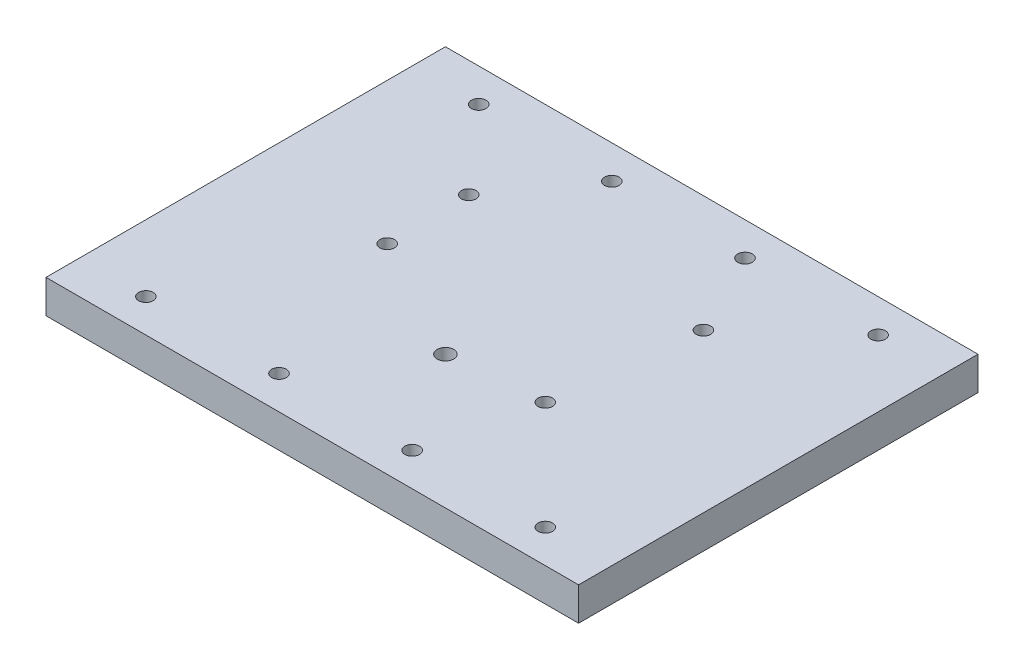
ISO-10303-21;
HEADER;
FILE_DESCRIPTION(('STEP AP214'),'2;1');
FILE_NAME('part.step','',(''),(''),'','','');
FILE_SCHEMA(('AUTOMOTIVE_DESIGN { 1 0 10303 214 1 1 1 1 }'));
ENDSEC;
DATA;
#1=APPLICATION_CONTEXT('core data for automotive mechanical design processes');
#2=APPLICATION_PROTOCOL_DEFINITION('international standard','automotive_design',2000,#1);
#3=PRODUCT_CONTEXT('',#1,'mechanical');
#4=PRODUCT('Part','Part','',(#3));
#5=PRODUCT_RELATED_PRODUCT_CATEGORY('part','',(#4));
#6=PRODUCT_DEFINITION_FORMATION('','',#4);
#7=PRODUCT_DEFINITION_CONTEXT('part definition',#1,'design');
#8=PRODUCT_DEFINITION('design','',#6,#7);
#9=PRODUCT_DEFINITION_SHAPE('','',#8);
#10=(LENGTH_UNIT() NAMED_UNIT(*) SI_UNIT(.MILLI.,.METRE.));
#11=(NAMED_UNIT(*) PLANE_ANGLE_UNIT() SI_UNIT($,.RADIAN.));
#12=(NAMED_UNIT(*) SI_UNIT($,.STERADIAN.) SOLID_ANGLE_UNIT());
#13=UNCERTAINTY_MEASURE_WITH_UNIT(LENGTH_MEASURE(1.E-05),#10,'distance_accuracy_value','');
#14=(GEOMETRIC_REPRESENTATION_CONTEXT(3) GLOBAL_UNCERTAINTY_ASSIGNED_CONTEXT((#13)) GLOBAL_UNIT_ASSIGNED_CONTEXT((#10,
#11,#12)) REPRESENTATION_CONTEXT('',''));
#15=CARTESIAN_POINT('',(0.,0.,0.));
#16=DIRECTION('',(0.,0.,1.));
#17=DIRECTION('',(1.,0.,0.));
#18=AXIS2_PLACEMENT_3D('',#15,#16,#17);
#19=CARTESIAN_POINT('',(177.8,0.,-139.7));
#20=DIRECTION('',(0.,1.,0.));
#21=DIRECTION('',(0.,0.,1.));
#22=AXIS2_PLACEMENT_3D('',#19,#20,#21);
#23=CYLINDRICAL_SURFACE('',#22,2.77812500000001);
#24=CARTESIAN_POINT('',(177.8,0.,-139.7));
#25=DIRECTION('',(0.,1.,0.));
#26=DIRECTION('',(0.,0.,1.));
#27=AXIS2_PLACEMENT_3D('',#24,#25,#26);
#28=CIRCLE('',#27,2.77812500000001);
#29=CARTESIAN_POINT('',(177.8,0.,-136.921875));
#30=VERTEX_POINT('',#29);
#31=EDGE_CURVE('E41',#30,#30,#28,.T.);
#32=ORIENTED_EDGE('',*,*,#31,.F.);
#33=EDGE_LOOP('',(#32));
#34=FACE_BOUND('',#33,.T.);
#35=CARTESIAN_POINT('',(177.8,12.7,-139.7));
#36=DIRECTION('',(0.,1.,0.));
#37=DIRECTION('',(0.,0.,1.));
#38=AXIS2_PLACEMENT_3D('',#35,#36,#37);
#39=CIRCLE('',#38,2.77812500000001);
#40=CARTESIAN_POINT('',(177.8,12.7,-136.921875));
#41=VERTEX_POINT('',#40);
#42=EDGE_CURVE('E11',#41,#41,#39,.T.);
#43=ORIENTED_EDGE('',*,*,#42,.T.);
#44=EDGE_LOOP('',(#43));
#45=FACE_BOUND('',#44,.T.);
#46=ADVANCED_FACE('F33',(#34,#45),#23,.F.);
#47=CARTESIAN_POINT('',(127.,0.,-139.7));
#48=DIRECTION('',(0.,1.,0.));
#49=DIRECTION('',(0.,0.,1.));
#50=AXIS2_PLACEMENT_3D('',#47,#48,#49);
#51=CYLINDRICAL_SURFACE('',#50,2.77812500000001);
#52=CARTESIAN_POINT('',(127.,0.,-139.7));
#53=DIRECTION('',(0.,1.,0.));
#54=DIRECTION('',(0.,0.,1.));
#55=AXIS2_PLACEMENT_3D('',#52,#53,#54);
#56=CIRCLE('',#55,2.77812500000001);
#57=CARTESIAN_POINT('',(127.,0.,-136.921875));
#58=VERTEX_POINT('',#57);
#59=EDGE_CURVE('E123',#58,#58,#56,.T.);
#60=ORIENTED_EDGE('',*,*,#59,.F.);
#61=EDGE_LOOP('',(#60));
#62=FACE_BOUND('',#61,.T.);
#63=CARTESIAN_POINT('',(127.,12.7,-139.7));
#64=DIRECTION('',(0.,1.,0.));
#65=DIRECTION('',(0.,0.,1.));
#66=AXIS2_PLACEMENT_3D('',#63,#64,#65);
#67=CIRCLE('',#66,2.77812500000001);
#68=CARTESIAN_POINT('',(127.,12.7,-136.921875));
#69=VERTEX_POINT('',#68);
#70=EDGE_CURVE('E126',#69,#69,#67,.T.);
#71=ORIENTED_EDGE('',*,*,#70,.T.);
#72=EDGE_LOOP('',(#71));
#73=FACE_BOUND('',#72,.T.);
#74=ADVANCED_FACE('F135',(#62,#73),#51,.F.);
#75=CARTESIAN_POINT('',(177.8,0.,-12.7));
#76=DIRECTION('',(0.,1.,0.));
#77=DIRECTION('',(0.,0.,1.));
#78=AXIS2_PLACEMENT_3D('',#75,#76,#77);
#79=CYLINDRICAL_SURFACE('',#78,2.778125);
#80=CARTESIAN_POINT('',(177.8,0.,-12.7));
#81=DIRECTION('',(0.,1.,0.));
#82=DIRECTION('',(0.,0.,1.));
#83=AXIS2_PLACEMENT_3D('',#80,#81,#82);
#84=CIRCLE('',#83,2.778125);
#85=CARTESIAN_POINT('',(177.8,0.,-9.921875));
#86=VERTEX_POINT('',#85);
#87=EDGE_CURVE('E117',#86,#86,#84,.T.);
#88=ORIENTED_EDGE('',*,*,#87,.F.);
#89=EDGE_LOOP('',(#88));
#90=FACE_BOUND('',#89,.T.);
#91=CARTESIAN_POINT('',(177.8,12.7,-12.7));
#92=DIRECTION('',(0.,1.,0.));
#93=DIRECTION('',(0.,0.,1.));
#94=AXIS2_PLACEMENT_3D('',#91,#92,#93);
#95=CIRCLE('',#94,2.778125);
#96=CARTESIAN_POINT('',(177.8,12.7,-9.921875));
#97=VERTEX_POINT('',#96);
#98=EDGE_CURVE('E120',#97,#97,#95,.T.);
#99=ORIENTED_EDGE('',*,*,#98,.T.);
#100=EDGE_LOOP('',(#99));
#101=FACE_BOUND('',#100,.T.);
#102=ADVANCED_FACE('F167',(#90,#101),#79,.F.);
#103=CARTESIAN_POINT('',(127.,0.,-12.7));
#104=DIRECTION('',(0.,1.,0.));
#105=DIRECTION('',(0.,0.,1.));
#106=AXIS2_PLACEMENT_3D('',#103,#104,#105);
#107=CYLINDRICAL_SURFACE('',#106,2.778125);
#108=CARTESIAN_POINT('',(127.,0.,-12.7));
#109=DIRECTION('',(0.,1.,0.));
#110=DIRECTION('',(0.,0.,1.));
#111=AXIS2_PLACEMENT_3D('',#108,#109,#110);
#112=CIRCLE('',#111,2.778125);
#113=CARTESIAN_POINT('',(127.,0.,-9.921875));
#114=VERTEX_POINT('',#113);
#115=EDGE_CURVE('E111',#114,#114,#112,.T.);
#116=ORIENTED_EDGE('',*,*,#115,.F.);
#117=EDGE_LOOP('',(#116));
#118=FACE_BOUND('',#117,.T.);
#119=CARTESIAN_POINT('',(127.,12.7,-12.7));
#120=DIRECTION('',(0.,1.,0.));
#121=DIRECTION('',(0.,0.,1.));
#122=AXIS2_PLACEMENT_3D('',#119,#120,#121);
#123=CIRCLE('',#122,2.778125);
#124=CARTESIAN_POINT('',(127.,12.7,-9.921875));
#125=VERTEX_POINT('',#124);
#126=EDGE_CURVE('E114',#125,#125,#123,.T.);
#127=ORIENTED_EDGE('',*,*,#126,.T.);
#128=EDGE_LOOP('',(#127));
#129=FACE_BOUND('',#128,.T.);
#130=ADVANCED_FACE('F163',(#118,#129),#107,.F.);
#131=CARTESIAN_POINT('',(0.,12.7,0.));
#132=DIRECTION('',(1.,0.,0.));
#133=DIRECTION('',(0.,0.,-1.));
#134=AXIS2_PLACEMENT_3D('',#131,#132,#133);
#135=PLANE('',#134);
#136=DIRECTION('',(0.,0.,1.));
#137=VECTOR('',#136,1.);
#138=CARTESIAN_POINT('',(0.,0.,0.));
#139=LINE('',#138,#137);
#140=CARTESIAN_POINT('',(0.,0.,-152.4));
#141=VERTEX_POINT('',#140);
#142=CARTESIAN_POINT('',(0.,0.,0.));
#143=VERTEX_POINT('',#142);
#144=EDGE_CURVE('E101',#141,#143,#139,.T.);
#145=ORIENTED_EDGE('',*,*,#144,.T.);
#146=DIRECTION('',(0.,-1.,0.));
#147=VECTOR('',#146,1.);
#148=CARTESIAN_POINT('',(0.,12.7,0.));
#149=LINE('',#148,#147);
#150=CARTESIAN_POINT('',(0.,12.7,0.));
#151=VERTEX_POINT('',#150);
#152=EDGE_CURVE('E92',#151,#143,#149,.T.);
#153=ORIENTED_EDGE('',*,*,#152,.F.);
#154=DIRECTION('',(0.,0.,1.));
#155=VECTOR('',#154,1.);
#156=CARTESIAN_POINT('',(0.,12.7,0.));
#157=LINE('',#156,#155);
#158=CARTESIAN_POINT('',(0.,12.7,-152.4));
#159=VERTEX_POINT('',#158);
#160=EDGE_CURVE('E86',#159,#151,#157,.T.);
#161=ORIENTED_EDGE('',*,*,#160,.F.);
#162=DIRECTION('',(0.,-1.,0.));
#163=VECTOR('',#162,1.);
#164=CARTESIAN_POINT('',(0.,12.7,-152.4));
#165=LINE('',#164,#163);
#166=EDGE_CURVE('E97',#159,#141,#165,.T.);
#167=ORIENTED_EDGE('',*,*,#166,.T.);
#168=EDGE_LOOP('',(#145,#153,#161,#167));
#169=FACE_BOUND('',#168,.T.);
#170=ADVANCED_FACE('F160',(#169),#135,.F.);
#171=CARTESIAN_POINT('',(0.,12.7,0.));
#172=DIRECTION('',(0.,0.,-1.));
#173=DIRECTION('',(-1.,0.,0.));
#174=AXIS2_PLACEMENT_3D('',#171,#172,#173);
#175=PLANE('',#174);
#176=DIRECTION('',(1.,0.,0.));
#177=VECTOR('',#176,1.);
#178=CARTESIAN_POINT('',(0.,0.,0.));
#179=LINE('',#178,#177);
#180=CARTESIAN_POINT('',(203.2,0.,0.));
#181=VERTEX_POINT('',#180);
#182=EDGE_CURVE('E91',#143,#181,#179,.T.);
#183=ORIENTED_EDGE('',*,*,#182,.T.);
#184=DIRECTION('',(0.,-1.,0.));
#185=VECTOR('',#184,1.);
#186=CARTESIAN_POINT('',(203.2,12.7,0.));
#187=LINE('',#186,#185);
#188=CARTESIAN_POINT('',(203.2,12.7,0.));
#189=VERTEX_POINT('',#188);
#190=EDGE_CURVE('E89',#189,#181,#187,.T.);
#191=ORIENTED_EDGE('',*,*,#190,.F.);
#192=DIRECTION('',(1.,0.,0.));
#193=VECTOR('',#192,1.);
#194=CARTESIAN_POINT('',(0.,12.7,0.));
#195=LINE('',#194,#193);
#196=EDGE_CURVE('E80',#151,#189,#195,.T.);
#197=ORIENTED_EDGE('',*,*,#196,.F.);
#198=ORIENTED_EDGE('',*,*,#152,.T.);
#199=EDGE_LOOP('',(#183,#191,#197,#198));
#200=FACE_BOUND('',#199,.T.);
#201=ADVANCED_FACE('F90',(#200),#175,.F.);
#202=CARTESIAN_POINT('',(203.2,12.7,0.));
#203=DIRECTION('',(-1.,0.,0.));
#204=DIRECTION('',(0.,0.,1.));
#205=AXIS2_PLACEMENT_3D('',#202,#203,#204);
#206=PLANE('',#205);
#207=DIRECTION('',(0.,0.,-1.));
#208=VECTOR('',#207,1.);
#209=CARTESIAN_POINT('',(203.2,0.,0.));
#210=LINE('',#209,#208);
#211=CARTESIAN_POINT('',(203.2,0.,-152.4));
#212=VERTEX_POINT('',#211);
#213=EDGE_CURVE('E66',#181,#212,#210,.T.);
#214=ORIENTED_EDGE('',*,*,#213,.T.);
#215=DIRECTION('',(0.,-1.,0.));
#216=VECTOR('',#215,1.);
#217=CARTESIAN_POINT('',(203.2,12.7,-152.4));
#218=LINE('',#217,#216);
#219=CARTESIAN_POINT('',(203.2,12.7,-152.4));
#220=VERTEX_POINT('',#219);
#221=EDGE_CURVE('E93',#220,#212,#218,.T.);
#222=ORIENTED_EDGE('',*,*,#221,.F.);
#223=DIRECTION('',(0.,0.,-1.));
#224=VECTOR('',#223,1.);
#225=CARTESIAN_POINT('',(203.2,12.7,0.));
#226=LINE('',#225,#224);
#227=EDGE_CURVE('E84',#189,#220,#226,.T.);
#228=ORIENTED_EDGE('',*,*,#227,.F.);
#229=ORIENTED_EDGE('',*,*,#190,.T.);
#230=EDGE_LOOP('',(#214,#222,#228,#229));
#231=FACE_BOUND('',#230,.T.);
#232=ADVANCED_FACE('F95',(#231),#206,.F.);
#233=CARTESIAN_POINT('',(0.,12.7,-152.4));
#234=DIRECTION('',(0.,0.,1.));
#235=DIRECTION('',(1.,0.,0.));
#236=AXIS2_PLACEMENT_3D('',#233,#234,#235);
#237=PLANE('',#236);
#238=DIRECTION('',(-1.,0.,0.));
#239=VECTOR('',#238,1.);
#240=CARTESIAN_POINT('',(0.,0.,-152.4));
#241=LINE('',#240,#239);
#242=EDGE_CURVE('E72',#212,#141,#241,.T.);
#243=ORIENTED_EDGE('',*,*,#242,.T.);
#244=ORIENTED_EDGE('',*,*,#166,.F.);
#245=DIRECTION('',(-1.,0.,0.));
#246=VECTOR('',#245,1.);
#247=CARTESIAN_POINT('',(0.,12.7,-152.4));
#248=LINE('',#247,#246);
#249=EDGE_CURVE('E49',#220,#159,#248,.T.);
#250=ORIENTED_EDGE('',*,*,#249,.F.);
#251=ORIENTED_EDGE('',*,*,#221,.T.);
#252=EDGE_LOOP('',(#243,#244,#250,#251));
#253=FACE_BOUND('',#252,.T.);
#254=ADVANCED_FACE('F139',(#253),#237,.F.);
#255=CARTESIAN_POINT('',(0.,12.7,0.));
#256=DIRECTION('',(0.,-1.,0.));
#257=DIRECTION('',(0.,0.,-1.));
#258=AXIS2_PLACEMENT_3D('',#255,#256,#257);
#259=PLANE('',#258);
#260=CARTESIAN_POINT('',(53.34,12.7,-107.95));
#261=DIRECTION('',(0.,1.,0.));
#262=DIRECTION('',(0.,0.,1.));
#263=AXIS2_PLACEMENT_3D('',#260,#261,#262);
#264=CIRCLE('',#263,2.77812500000001);
#265=CARTESIAN_POINT('',(53.34,12.7,-105.171875));
#266=VERTEX_POINT('',#265);
#267=EDGE_CURVE('E319',#266,#266,#264,.T.);
#268=ORIENTED_EDGE('',*,*,#267,.F.);
#269=EDGE_LOOP('',(#268));
#270=FACE_BOUND('',#269,.T.);
#271=CARTESIAN_POINT('',(101.6,12.7,-50.8));
#272=DIRECTION('',(0.,1.,0.));
#273=DIRECTION('',(0.,0.,1.));
#274=AXIS2_PLACEMENT_3D('',#271,#272,#273);
#275=CIRCLE('',#274,3.175);
#276=CARTESIAN_POINT('',(101.6,12.7,-47.625));
#277=VERTEX_POINT('',#276);
#278=EDGE_CURVE('E325',#277,#277,#275,.T.);
#279=ORIENTED_EDGE('',*,*,#278,.F.);
#280=EDGE_LOOP('',(#279));
#281=FACE_BOUND('',#280,.T.);
#282=CARTESIAN_POINT('',(142.875,12.7,-107.95));
#283=DIRECTION('',(0.,1.,0.));
#284=DIRECTION('',(0.,0.,1.));
#285=AXIS2_PLACEMENT_3D('',#282,#283,#284);
#286=CIRCLE('',#285,2.77812500000002);
#287=CARTESIAN_POINT('',(142.875,12.7,-105.171875));
#288=VERTEX_POINT('',#287);
#289=EDGE_CURVE('E333',#288,#288,#286,.T.);
#290=ORIENTED_EDGE('',*,*,#289,.F.);
#291=EDGE_LOOP('',(#290));
#292=FACE_BOUND('',#291,.T.);
#293=CARTESIAN_POINT('',(136.525,12.7,-53.975));
#294=DIRECTION('',(0.,1.,0.));
#295=DIRECTION('',(0.,0.,1.));
#296=AXIS2_PLACEMENT_3D('',#293,#294,#295);
#297=CIRCLE('',#296,2.77812500000002);
#298=CARTESIAN_POINT('',(136.525,12.7,-51.196875));
#299=VERTEX_POINT('',#298);
#300=EDGE_CURVE('E339',#299,#299,#297,.T.);
#301=ORIENTED_EDGE('',*,*,#300,.F.);
#302=EDGE_LOOP('',(#301));
#303=FACE_BOUND('',#302,.T.);
#304=CARTESIAN_POINT('',(53.975,12.7,-76.2));
#305=DIRECTION('',(0.,1.,0.));
#306=DIRECTION('',(0.,0.,1.));
#307=AXIS2_PLACEMENT_3D('',#304,#305,#306);
#308=CIRCLE('',#307,2.77812500000001);
#309=CARTESIAN_POINT('',(53.975,12.7,-73.421875));
#310=VERTEX_POINT('',#309);
#311=EDGE_CURVE('E322',#310,#310,#308,.T.);
#312=ORIENTED_EDGE('',*,*,#311,.F.);
#313=EDGE_LOOP('',(#312));
#314=FACE_BOUND('',#313,.T.);
#315=CARTESIAN_POINT('',(76.2,12.7,-139.7));
#316=DIRECTION('',(0.,1.,0.));
#317=DIRECTION('',(0.,0.,1.));
#318=AXIS2_PLACEMENT_3D('',#315,#316,#317);
#319=CIRCLE('',#318,2.77812500000001);
#320=CARTESIAN_POINT('',(76.2,12.7,-136.921875));
#321=VERTEX_POINT('',#320);
#322=EDGE_CURVE('E350',#321,#321,#319,.T.);
#323=ORIENTED_EDGE('',*,*,#322,.F.);
#324=EDGE_LOOP('',(#323));
#325=FACE_BOUND('',#324,.T.);
#326=CARTESIAN_POINT('',(76.2,12.7,-12.7));
#327=DIRECTION('',(0.,1.,0.));
#328=DIRECTION('',(0.,0.,1.));
#329=AXIS2_PLACEMENT_3D('',#326,#327,#328);
#330=CIRCLE('',#329,2.778125);
#331=CARTESIAN_POINT('',(76.2,12.7,-9.921875));
#332=VERTEX_POINT('',#331);
#333=EDGE_CURVE('E356',#332,#332,#330,.T.);
#334=ORIENTED_EDGE('',*,*,#333,.F.);
#335=EDGE_LOOP('',(#334));
#336=FACE_BOUND('',#335,.T.);
#337=CARTESIAN_POINT('',(25.4,12.7,-12.7));
#338=DIRECTION('',(0.,1.,0.));
#339=DIRECTION('',(0.,0.,1.));
#340=AXIS2_PLACEMENT_3D('',#337,#338,#339);
#341=CIRCLE('',#340,2.778125);
#342=CARTESIAN_POINT('',(25.4,12.7,-9.921875));
#343=VERTEX_POINT('',#342);
#344=EDGE_CURVE('E359',#343,#343,#341,.T.);
#345=ORIENTED_EDGE('',*,*,#344,.F.);
#346=EDGE_LOOP('',(#345));
#347=FACE_BOUND('',#346,.T.);
#348=CARTESIAN_POINT('',(25.4,12.7,-139.7));
#349=DIRECTION('',(0.,1.,0.));
#350=DIRECTION('',(0.,0.,1.));
#351=AXIS2_PLACEMENT_3D('',#348,#349,#350);
#352=CIRCLE('',#351,2.77812500000001);
#353=CARTESIAN_POINT('',(25.4,12.7,-136.921875));
#354=VERTEX_POINT('',#353);
#355=EDGE_CURVE('E363',#354,#354,#352,.T.);
#356=ORIENTED_EDGE('',*,*,#355,.F.);
#357=EDGE_LOOP('',(#356));
#358=FACE_BOUND('',#357,.T.);
#359=ORIENTED_EDGE('',*,*,#160,.T.);
#360=ORIENTED_EDGE('',*,*,#196,.T.);
#361=ORIENTED_EDGE('',*,*,#227,.T.);
#362=ORIENTED_EDGE('',*,*,#249,.T.);
#363=EDGE_LOOP('',(#359,#360,#361,#362));
#364=FACE_BOUND('',#363,.T.);
#365=ORIENTED_EDGE('',*,*,#126,.F.);
#366=EDGE_LOOP('',(#365));
#367=FACE_BOUND('',#366,.T.);
#368=ORIENTED_EDGE('',*,*,#98,.F.);
#369=EDGE_LOOP('',(#368));
#370=FACE_BOUND('',#369,.T.);
#371=ORIENTED_EDGE('',*,*,#70,.F.);
#372=EDGE_LOOP('',(#371));
#373=FACE_BOUND('',#372,.T.);
#374=ORIENTED_EDGE('',*,*,#42,.F.);
#375=EDGE_LOOP('',(#374));
#376=FACE_BOUND('',#375,.T.);
#377=ADVANCED_FACE('F81',(#270,#281,#292,#303,#314,#325,#336,#347,#358,#364,#367,#370,#373,
#376),#259,.F.);
#378=CARTESIAN_POINT('',(0.,0.,0.));
#379=DIRECTION('',(0.,-1.,0.));
#380=DIRECTION('',(0.,0.,-1.));
#381=AXIS2_PLACEMENT_3D('',#378,#379,#380);
#382=PLANE('',#381);
#383=CARTESIAN_POINT('',(53.34,0.,-107.95));
#384=DIRECTION('',(0.,1.,0.));
#385=DIRECTION('',(0.,0.,1.));
#386=AXIS2_PLACEMENT_3D('',#383,#384,#385);
#387=CIRCLE('',#386,2.77812500000001);
#388=CARTESIAN_POINT('',(53.34,0.,-105.171875));
#389=VERTEX_POINT('',#388);
#390=EDGE_CURVE('E317',#389,#389,#387,.T.);
#391=ORIENTED_EDGE('',*,*,#390,.T.);
#392=EDGE_LOOP('',(#391));
#393=FACE_BOUND('',#392,.T.);
#394=CARTESIAN_POINT('',(101.6,0.,-50.8));
#395=DIRECTION('',(0.,1.,0.));
#396=DIRECTION('',(0.,0.,1.));
#397=AXIS2_PLACEMENT_3D('',#394,#395,#396);
#398=CIRCLE('',#397,3.175);
#399=CARTESIAN_POINT('',(101.6,0.,-47.625));
#400=VERTEX_POINT('',#399);
#401=EDGE_CURVE('E320',#400,#400,#398,.T.);
#402=ORIENTED_EDGE('',*,*,#401,.T.);
#403=EDGE_LOOP('',(#402));
#404=FACE_BOUND('',#403,.T.);
#405=CARTESIAN_POINT('',(142.875,0.,-107.95));
#406=DIRECTION('',(0.,1.,0.));
#407=DIRECTION('',(0.,0.,1.));
#408=AXIS2_PLACEMENT_3D('',#405,#406,#407);
#409=CIRCLE('',#408,2.77812500000002);
#410=CARTESIAN_POINT('',(142.875,0.,-105.171875));
#411=VERTEX_POINT('',#410);
#412=EDGE_CURVE('E330',#411,#411,#409,.T.);
#413=ORIENTED_EDGE('',*,*,#412,.T.);
#414=EDGE_LOOP('',(#413));
#415=FACE_BOUND('',#414,.T.);
#416=CARTESIAN_POINT('',(136.525,0.,-53.975));
#417=DIRECTION('',(0.,1.,0.));
#418=DIRECTION('',(0.,0.,1.));
#419=AXIS2_PLACEMENT_3D('',#416,#417,#418);
#420=CIRCLE('',#419,2.77812500000002);
#421=CARTESIAN_POINT('',(136.525,0.,-51.196875));
#422=VERTEX_POINT('',#421);
#423=EDGE_CURVE('E336',#422,#422,#420,.T.);
#424=ORIENTED_EDGE('',*,*,#423,.T.);
#425=EDGE_LOOP('',(#424));
#426=FACE_BOUND('',#425,.T.);
#427=CARTESIAN_POINT('',(53.975,0.,-76.2));
#428=DIRECTION('',(0.,1.,0.));
#429=DIRECTION('',(0.,0.,1.));
#430=AXIS2_PLACEMENT_3D('',#427,#428,#429);
#431=CIRCLE('',#430,2.77812500000001);
#432=CARTESIAN_POINT('',(53.975,0.,-73.421875));
#433=VERTEX_POINT('',#432);
#434=EDGE_CURVE('E342',#433,#433,#431,.T.);
#435=ORIENTED_EDGE('',*,*,#434,.T.);
#436=EDGE_LOOP('',(#435));
#437=FACE_BOUND('',#436,.T.);
#438=CARTESIAN_POINT('',(76.2,0.,-139.7));
#439=DIRECTION('',(0.,1.,0.));
#440=DIRECTION('',(0.,0.,1.));
#441=AXIS2_PLACEMENT_3D('',#438,#439,#440);
#442=CIRCLE('',#441,2.77812500000001);
#443=CARTESIAN_POINT('',(76.2,0.,-136.921875));
#444=VERTEX_POINT('',#443);
#445=EDGE_CURVE('E345',#444,#444,#442,.T.);
#446=ORIENTED_EDGE('',*,*,#445,.T.);
#447=EDGE_LOOP('',(#446));
#448=FACE_BOUND('',#447,.T.);
#449=CARTESIAN_POINT('',(76.2,0.,-12.7));
#450=DIRECTION('',(0.,1.,0.));
#451=DIRECTION('',(0.,0.,1.));
#452=AXIS2_PLACEMENT_3D('',#449,#450,#451);
#453=CIRCLE('',#452,2.778125);
#454=CARTESIAN_POINT('',(76.2,0.,-9.921875));
#455=VERTEX_POINT('',#454);
#456=EDGE_CURVE('E353',#455,#455,#453,.T.);
#457=ORIENTED_EDGE('',*,*,#456,.T.);
#458=EDGE_LOOP('',(#457));
#459=FACE_BOUND('',#458,.T.);
#460=CARTESIAN_POINT('',(25.4,0.,-12.7));
#461=DIRECTION('',(0.,1.,0.));
#462=DIRECTION('',(0.,0.,1.));
#463=AXIS2_PLACEMENT_3D('',#460,#461,#462);
#464=CIRCLE('',#463,2.778125);
#465=CARTESIAN_POINT('',(25.4,0.,-9.921875));
#466=VERTEX_POINT('',#465);
#467=EDGE_CURVE('E360',#466,#466,#464,.T.);
#468=ORIENTED_EDGE('',*,*,#467,.T.);
#469=EDGE_LOOP('',(#468));
#470=FACE_BOUND('',#469,.T.);
#471=CARTESIAN_POINT('',(25.4,0.,-139.7));
#472=DIRECTION('',(0.,1.,0.));
#473=DIRECTION('',(0.,0.,1.));
#474=AXIS2_PLACEMENT_3D('',#471,#472,#473);
#475=CIRCLE('',#474,2.77812500000001);
#476=CARTESIAN_POINT('',(25.4,0.,-136.921875));
#477=VERTEX_POINT('',#476);
#478=EDGE_CURVE('E104',#477,#477,#475,.T.);
#479=ORIENTED_EDGE('',*,*,#478,.T.);
#480=EDGE_LOOP('',(#479));
#481=FACE_BOUND('',#480,.T.);
#482=ORIENTED_EDGE('',*,*,#144,.F.);
#483=ORIENTED_EDGE('',*,*,#242,.F.);
#484=ORIENTED_EDGE('',*,*,#213,.F.);
#485=ORIENTED_EDGE('',*,*,#182,.F.);
#486=EDGE_LOOP('',(#482,#483,#484,#485));
#487=FACE_BOUND('',#486,.T.);
#488=ORIENTED_EDGE('',*,*,#115,.T.);
#489=EDGE_LOOP('',(#488));
#490=FACE_BOUND('',#489,.T.);
#491=ORIENTED_EDGE('',*,*,#87,.T.);
#492=EDGE_LOOP('',(#491));
#493=FACE_BOUND('',#492,.T.);
#494=ORIENTED_EDGE('',*,*,#59,.T.);
#495=EDGE_LOOP('',(#494));
#496=FACE_BOUND('',#495,.T.);
#497=ORIENTED_EDGE('',*,*,#31,.T.);
#498=EDGE_LOOP('',(#497));
#499=FACE_BOUND('',#498,.T.);
#500=ADVANCED_FACE('F131',(#393,#404,#415,#426,#437,#448,#459,#470,#481,#487,#490,#493,#496,
#499),#382,.T.);
#501=CARTESIAN_POINT('',(25.4,0.,-139.7));
#502=DIRECTION('',(0.,1.,0.));
#503=DIRECTION('',(0.,0.,1.));
#504=AXIS2_PLACEMENT_3D('',#501,#502,#503);
#505=CYLINDRICAL_SURFACE('',#504,2.77812500000001);
#506=ORIENTED_EDGE('',*,*,#478,.F.);
#507=EDGE_LOOP('',(#506));
#508=FACE_BOUND('',#507,.T.);
#509=ORIENTED_EDGE('',*,*,#355,.T.);
#510=EDGE_LOOP('',(#509));
#511=FACE_BOUND('',#510,.T.);
#512=ADVANCED_FACE('F146',(#508,#511),#505,.F.);
#513=CARTESIAN_POINT('',(25.4,0.,-12.7));
#514=DIRECTION('',(0.,1.,0.));
#515=DIRECTION('',(0.,0.,1.));
#516=AXIS2_PLACEMENT_3D('',#513,#514,#515);
#517=CYLINDRICAL_SURFACE('',#516,2.778125);
#518=ORIENTED_EDGE('',*,*,#467,.F.);
#519=EDGE_LOOP('',(#518));
#520=FACE_BOUND('',#519,.T.);
#521=ORIENTED_EDGE('',*,*,#344,.T.);
#522=EDGE_LOOP('',(#521));
#523=FACE_BOUND('',#522,.T.);
#524=ADVANCED_FACE('F225',(#520,#523),#517,.F.);
#525=CARTESIAN_POINT('',(76.2,0.,-12.7));
#526=DIRECTION('',(0.,1.,0.));
#527=DIRECTION('',(0.,0.,1.));
#528=AXIS2_PLACEMENT_3D('',#525,#526,#527);
#529=CYLINDRICAL_SURFACE('',#528,2.778125);
#530=ORIENTED_EDGE('',*,*,#456,.F.);
#531=EDGE_LOOP('',(#530));
#532=FACE_BOUND('',#531,.T.);
#533=ORIENTED_EDGE('',*,*,#333,.T.);
#534=EDGE_LOOP('',(#533));
#535=FACE_BOUND('',#534,.T.);
#536=ADVANCED_FACE('F231',(#532,#535),#529,.F.);
#537=CARTESIAN_POINT('',(76.2,0.,-139.7));
#538=DIRECTION('',(0.,1.,0.));
#539=DIRECTION('',(0.,0.,1.));
#540=AXIS2_PLACEMENT_3D('',#537,#538,#539);
#541=CYLINDRICAL_SURFACE('',#540,2.77812500000001);
#542=ORIENTED_EDGE('',*,*,#445,.F.);
#543=EDGE_LOOP('',(#542));
#544=FACE_BOUND('',#543,.T.);
#545=ORIENTED_EDGE('',*,*,#322,.T.);
#546=EDGE_LOOP('',(#545));
#547=FACE_BOUND('',#546,.T.);
#548=ADVANCED_FACE('F237',(#544,#547),#541,.F.);
#549=CARTESIAN_POINT('',(53.975,0.,-76.2));
#550=DIRECTION('',(0.,1.,0.));
#551=DIRECTION('',(0.,0.,1.));
#552=AXIS2_PLACEMENT_3D('',#549,#550,#551);
#553=CYLINDRICAL_SURFACE('',#552,2.77812500000001);
#554=ORIENTED_EDGE('',*,*,#434,.F.);
#555=EDGE_LOOP('',(#554));
#556=FACE_BOUND('',#555,.T.);
#557=ORIENTED_EDGE('',*,*,#311,.T.);
#558=EDGE_LOOP('',(#557));
#559=FACE_BOUND('',#558,.T.);
#560=ADVANCED_FACE('F244',(#556,#559),#553,.F.);
#561=CARTESIAN_POINT('',(136.525,0.,-53.975));
#562=DIRECTION('',(0.,1.,0.));
#563=DIRECTION('',(0.,0.,1.));
#564=AXIS2_PLACEMENT_3D('',#561,#562,#563);
#565=CYLINDRICAL_SURFACE('',#564,2.77812500000002);
#566=ORIENTED_EDGE('',*,*,#423,.F.);
#567=EDGE_LOOP('',(#566));
#568=FACE_BOUND('',#567,.T.);
#569=ORIENTED_EDGE('',*,*,#300,.T.);
#570=EDGE_LOOP('',(#569));
#571=FACE_BOUND('',#570,.T.);
#572=ADVANCED_FACE('F251',(#568,#571),#565,.F.);
#573=CARTESIAN_POINT('',(142.875,0.,-107.95));
#574=DIRECTION('',(0.,1.,0.));
#575=DIRECTION('',(0.,0.,1.));
#576=AXIS2_PLACEMENT_3D('',#573,#574,#575);
#577=CYLINDRICAL_SURFACE('',#576,2.77812500000002);
#578=ORIENTED_EDGE('',*,*,#412,.F.);
#579=EDGE_LOOP('',(#578));
#580=FACE_BOUND('',#579,.T.);
#581=ORIENTED_EDGE('',*,*,#289,.T.);
#582=EDGE_LOOP('',(#581));
#583=FACE_BOUND('',#582,.T.);
#584=ADVANCED_FACE('F259',(#580,#583),#577,.F.);
#585=CARTESIAN_POINT('',(101.6,0.,-50.8));
#586=DIRECTION('',(0.,1.,0.));
#587=DIRECTION('',(0.,0.,1.));
#588=AXIS2_PLACEMENT_3D('',#585,#586,#587);
#589=CYLINDRICAL_SURFACE('',#588,3.175);
#590=ORIENTED_EDGE('',*,*,#401,.F.);
#591=EDGE_LOOP('',(#590));
#592=FACE_BOUND('',#591,.T.);
#593=ORIENTED_EDGE('',*,*,#278,.T.);
#594=EDGE_LOOP('',(#593));
#595=FACE_BOUND('',#594,.T.);
#596=ADVANCED_FACE('F267',(#592,#595),#589,.F.);
#597=CARTESIAN_POINT('',(53.34,0.,-107.95));
#598=DIRECTION('',(0.,1.,0.));
#599=DIRECTION('',(0.,0.,1.));
#600=AXIS2_PLACEMENT_3D('',#597,#598,#599);
#601=CYLINDRICAL_SURFACE('',#600,2.77812500000001);
#602=ORIENTED_EDGE('',*,*,#390,.F.);
#603=EDGE_LOOP('',(#602));
#604=FACE_BOUND('',#603,.T.);
#605=ORIENTED_EDGE('',*,*,#267,.T.);
#606=EDGE_LOOP('',(#605));
#607=FACE_BOUND('',#606,.T.);
#608=ADVANCED_FACE('F275',(#604,#607),#601,.F.);
#609=CLOSED_SHELL('',(#46,#74,#102,#130,#170,#201,#232,#254,#377,#500,#512,#524,#536,#548,#560,
#572,#584,#596,#608));
#610=MANIFOLD_SOLID_BREP('B2',#609);
#611=ADVANCED_BREP_SHAPE_REPRESENTATION('',(#18,#610),#14);
#612=SHAPE_DEFINITION_REPRESENTATION(#9,#611);
ENDSEC;
END-ISO-10303-21;
